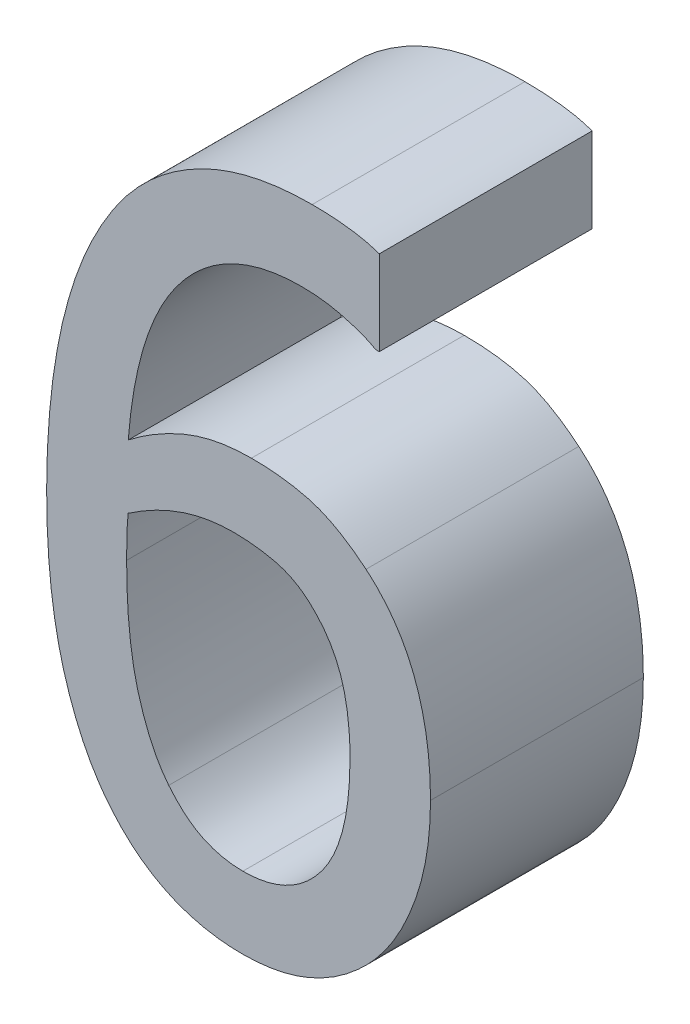
ISO-10303-21;
HEADER;
FILE_DESCRIPTION(('STEP AP214'),'2;1');
FILE_NAME('part.step','',(''),(''),'','','');
FILE_SCHEMA(('AUTOMOTIVE_DESIGN { 1 0 10303 214 1 1 1 1 }'));
ENDSEC;
DATA;
#1=APPLICATION_CONTEXT('core data for automotive mechanical design processes');
#2=APPLICATION_PROTOCOL_DEFINITION('international standard','automotive_design',2000,#1);
#3=PRODUCT_CONTEXT('',#1,'mechanical');
#4=PRODUCT('Part','Part','',(#3));
#5=PRODUCT_RELATED_PRODUCT_CATEGORY('part','',(#4));
#6=PRODUCT_DEFINITION_FORMATION('','',#4);
#7=PRODUCT_DEFINITION_CONTEXT('part definition',#1,'design');
#8=PRODUCT_DEFINITION('design','',#6,#7);
#9=PRODUCT_DEFINITION_SHAPE('','',#8);
#10=(LENGTH_UNIT() NAMED_UNIT(*) SI_UNIT(.MILLI.,.METRE.));
#11=(NAMED_UNIT(*) PLANE_ANGLE_UNIT() SI_UNIT($,.RADIAN.));
#12=(NAMED_UNIT(*) SI_UNIT($,.STERADIAN.) SOLID_ANGLE_UNIT());
#13=UNCERTAINTY_MEASURE_WITH_UNIT(LENGTH_MEASURE(1.E-05),#10,'distance_accuracy_value','');
#14=(GEOMETRIC_REPRESENTATION_CONTEXT(3) GLOBAL_UNCERTAINTY_ASSIGNED_CONTEXT((#13)) GLOBAL_UNIT_ASSIGNED_CONTEXT((#10,
#11,#12)) REPRESENTATION_CONTEXT('',''));
#15=CARTESIAN_POINT('',(0.,0.,0.));
#16=DIRECTION('',(0.,0.,1.));
#17=DIRECTION('',(1.,0.,0.));
#18=AXIS2_PLACEMENT_3D('',#15,#16,#17);
#19=CARTESIAN_POINT('',(-3.363706636507,0.216730596900024,0.));
#20=CARTESIAN_POINT('',(-3.363706636507,0.216730596900024,0.1));
#21=CARTESIAN_POINT('',(-3.34116263985,0.216730596900024,0.));
#22=CARTESIAN_POINT('',(-3.34116263985,0.216730596900024,0.1));
#23=CARTESIAN_POINT('',(-3.313358377307,0.252300013847772,0.));
#24=CARTESIAN_POINT('',(-3.313358377307,0.252300013847772,0.1));
#25=CARTESIAN_POINT('',(-3.313358377307,0.287869430795519,0.));
#26=CARTESIAN_POINT('',(-3.313358377307,0.287869430795519,0.1));
#27=B_SPLINE_SURFACE_WITH_KNOTS('',2,1,((#19,#20),(#21,#22),(#23,#24),(#25,#26)),.UNSPECIFIED.,
.F.,.F.,.F.,(3,1,3),(2,2),(0.,1.,2.),(0.,0.01),.UNSPECIFIED.);
#28=CARTESIAN_POINT('',(-3.363706636507,0.216730596900024,0.));
#29=CARTESIAN_POINT('',(-3.34116263985,0.216730596900024,0.));
#30=CARTESIAN_POINT('',(-3.313358377307,0.252300013847772,0.));
#31=CARTESIAN_POINT('',(-3.313358377307,0.287869430795519,0.));
#32=B_SPLINE_CURVE_WITH_KNOTS('',2,(#28,#29,#30,#31),.UNSPECIFIED.,.F.,.F.,(3,1,3),(0.,1.,2.),.UNSPECIFIED.);
#33=CARTESIAN_POINT('',(-3.363706636507,0.216730596900024,0.));
#34=VERTEX_POINT('',#33);
#35=CARTESIAN_POINT('',(-3.313358377307,0.287869430795519,0.));
#36=VERTEX_POINT('',#35);
#37=EDGE_CURVE('E11',#34,#36,#32,.T.);
#38=DIRECTION('',(0.,0.,1.));
#39=VECTOR('',#38,1.);
#40=CARTESIAN_POINT('',(-3.363706636507,0.216730596900024,0.));
#41=LINE('',#40,#39);
#42=CARTESIAN_POINT('',(-3.363706636507,0.216730596900024,0.1));
#43=VERTEX_POINT('',#42);
#44=EDGE_CURVE('E28',#34,#43,#41,.T.);
#45=CARTESIAN_POINT('',(-3.313358377307,0.287869430795519,0.1));
#46=CARTESIAN_POINT('',(-3.313358377307,0.252300013847772,0.1));
#47=CARTESIAN_POINT('',(-3.34116263985,0.216730596900024,0.1));
#48=CARTESIAN_POINT('',(-3.363706636507,0.216730596900024,0.1));
#49=B_SPLINE_CURVE_WITH_KNOTS('',2,(#45,#46,#47,#48),.UNSPECIFIED.,.F.,.F.,(3,1,3),(-2.,-1.,0.),.UNSPECIFIED.);
#50=CARTESIAN_POINT('',(-3.313358377307,0.287869430795519,0.1));
#51=VERTEX_POINT('',#50);
#52=EDGE_CURVE('E513',#51,#43,#49,.T.);
#53=DIRECTION('',(0.,0.,1.));
#54=VECTOR('',#53,1.);
#55=CARTESIAN_POINT('',(-3.313358377307,0.287869430795519,0.));
#56=LINE('',#55,#54);
#57=EDGE_CURVE('E41',#36,#51,#56,.T.);
#58=ORIENTED_EDGE('',*,*,#37,.F.);
#59=ORIENTED_EDGE('',*,*,#44,.T.);
#60=ORIENTED_EDGE('',*,*,#52,.F.);
#61=ORIENTED_EDGE('',*,*,#57,.F.);
#62=EDGE_LOOP('',(#58,#59,#60,#61));
#63=FACE_BOUND('',#62,.T.);
#64=ADVANCED_FACE('F17',(#63),#27,.F.);
#65=CARTESIAN_POINT('',(-3.3985245869,0.234264816522153,0.));
#66=CARTESIAN_POINT('',(-3.3985245869,0.234264816522153,0.1));
#67=CARTESIAN_POINT('',(-3.390508943644,0.22449575130411,0.));
#68=CARTESIAN_POINT('',(-3.390508943644,0.22449575130411,0.1));
#69=CARTESIAN_POINT('',(-3.373475701725,0.216730596900024,0.));
#70=CARTESIAN_POINT('',(-3.373475701725,0.216730596900024,0.1));
#71=CARTESIAN_POINT('',(-3.363706636507,0.216730596900024,0.));
#72=CARTESIAN_POINT('',(-3.363706636507,0.216730596900024,0.1));
#73=B_SPLINE_SURFACE_WITH_KNOTS('',2,1,((#65,#66),(#67,#68),(#69,#70),(#71,#72)),.UNSPECIFIED.,
.F.,.F.,.F.,(3,1,3),(2,2),(0.,1.,2.),(0.,0.01),.UNSPECIFIED.);
#74=CARTESIAN_POINT('',(-3.3985245869,0.234264816522153,0.));
#75=CARTESIAN_POINT('',(-3.390508943644,0.22449575130411,0.));
#76=CARTESIAN_POINT('',(-3.373475701725,0.216730596900024,0.));
#77=CARTESIAN_POINT('',(-3.363706636507,0.216730596900024,0.));
#78=B_SPLINE_CURVE_WITH_KNOTS('',2,(#74,#75,#76,#77),.UNSPECIFIED.,.F.,.F.,(3,1,3),(0.,1.,2.),.UNSPECIFIED.);
#79=CARTESIAN_POINT('',(-3.3985245869,0.234264816522153,0.));
#80=VERTEX_POINT('',#79);
#81=EDGE_CURVE('E504',#80,#34,#78,.T.);
#82=DIRECTION('',(0.,0.,1.));
#83=VECTOR('',#82,1.);
#84=CARTESIAN_POINT('',(-3.3985245869,0.234264816522153,0.));
#85=LINE('',#84,#83);
#86=CARTESIAN_POINT('',(-3.3985245869,0.234264816522153,0.1));
#87=VERTEX_POINT('',#86);
#88=EDGE_CURVE('E498',#80,#87,#85,.T.);
#89=CARTESIAN_POINT('',(-3.363706636507,0.216730596900024,0.1));
#90=CARTESIAN_POINT('',(-3.373475701725,0.216730596900024,0.1));
#91=CARTESIAN_POINT('',(-3.390508943644,0.22449575130411,0.1));
#92=CARTESIAN_POINT('',(-3.3985245869,0.234264816522153,0.1));
#93=B_SPLINE_CURVE_WITH_KNOTS('',2,(#89,#90,#91,#92),.UNSPECIFIED.,.F.,.F.,(3,1,3),(-2.,-1.,0.),.UNSPECIFIED.);
#94=EDGE_CURVE('E491',#43,#87,#93,.T.);
#95=ORIENTED_EDGE('',*,*,#81,.F.);
#96=ORIENTED_EDGE('',*,*,#88,.T.);
#97=ORIENTED_EDGE('',*,*,#94,.F.);
#98=ORIENTED_EDGE('',*,*,#44,.F.);
#99=EDGE_LOOP('',(#95,#96,#97,#98));
#100=FACE_BOUND('',#99,.T.);
#101=ADVANCED_FACE('F519',(#100),#73,.F.);
#102=CARTESIAN_POINT('',(-3.418313206188,0.315924182190926,0.));
#103=CARTESIAN_POINT('',(-3.418313206188,0.315924182190926,0.1));
#104=CARTESIAN_POINT('',(-3.418313206188,0.283861609167604,0.));
#105=CARTESIAN_POINT('',(-3.418313206188,0.283861609167604,0.1));
#106=CARTESIAN_POINT('',(-3.407041207859,0.244534859443686,0.));
#107=CARTESIAN_POINT('',(-3.407041207859,0.244534859443686,0.1));
#108=CARTESIAN_POINT('',(-3.3985245869,0.234264816522153,0.));
#109=CARTESIAN_POINT('',(-3.3985245869,0.234264816522153,0.1));
#110=B_SPLINE_SURFACE_WITH_KNOTS('',2,1,((#102,#103),(#104,#105),(#106,#107),(#108,#109)),
.UNSPECIFIED.,.F.,.F.,.F.,(3,1,3),(2,2),(0.,1.,2.),(0.,0.01),.UNSPECIFIED.);
#111=CARTESIAN_POINT('',(-3.418313206188,0.315924182190926,0.));
#112=CARTESIAN_POINT('',(-3.418313206188,0.283861609167604,0.));
#113=CARTESIAN_POINT('',(-3.407041207859,0.244534859443686,0.));
#114=CARTESIAN_POINT('',(-3.3985245869,0.234264816522153,0.));
#115=B_SPLINE_CURVE_WITH_KNOTS('',2,(#111,#112,#113,#114),.UNSPECIFIED.,.F.,.F.,(3,1,3),(0.,1.,
2.),.UNSPECIFIED.);
#116=CARTESIAN_POINT('',(-3.418313206188,0.315924182190926,0.));
#117=VERTEX_POINT('',#116);
#118=EDGE_CURVE('E486',#117,#80,#115,.T.);
#119=DIRECTION('',(0.,0.,1.));
#120=VECTOR('',#119,1.);
#121=CARTESIAN_POINT('',(-3.418313206188,0.315924182190926,0.));
#122=LINE('',#121,#120);
#123=CARTESIAN_POINT('',(-3.418313206188,0.315924182190926,0.1));
#124=VERTEX_POINT('',#123);
#125=EDGE_CURVE('E480',#117,#124,#122,.T.);
#126=CARTESIAN_POINT('',(-3.3985245869,0.234264816522153,0.1));
#127=CARTESIAN_POINT('',(-3.407041207859,0.244534859443686,0.1));
#128=CARTESIAN_POINT('',(-3.418313206188,0.283861609167604,0.1));
#129=CARTESIAN_POINT('',(-3.418313206188,0.315924182190926,0.1));
#130=B_SPLINE_CURVE_WITH_KNOTS('',2,(#126,#127,#128,#129),.UNSPECIFIED.,.F.,.F.,(3,1,3),(-2.,
-1.,0.),.UNSPECIFIED.);
#131=EDGE_CURVE('E473',#87,#124,#130,.T.);
#132=ORIENTED_EDGE('',*,*,#118,.F.);
#133=ORIENTED_EDGE('',*,*,#125,.T.);
#134=ORIENTED_EDGE('',*,*,#131,.F.);
#135=ORIENTED_EDGE('',*,*,#88,.F.);
#136=EDGE_LOOP('',(#132,#133,#134,#135));
#137=FACE_BOUND('',#136,.T.);
#138=ADVANCED_FACE('F532',(#137),#110,.F.);
#139=CARTESIAN_POINT('',(-3.417561739632,0.335462312627012,0.));
#140=CARTESIAN_POINT('',(-3.417561739632,0.335462312627012,0.1));
#141=CARTESIAN_POINT('',(-3.418062717336,0.330953513295608,0.));
#142=CARTESIAN_POINT('',(-3.418062717336,0.330953513295608,0.1));
#143=CARTESIAN_POINT('',(-3.418313206188,0.322436892336288,0.));
#144=CARTESIAN_POINT('',(-3.418313206188,0.322436892336288,0.1));
#145=CARTESIAN_POINT('',(-3.418313206188,0.315924182190926,0.));
#146=CARTESIAN_POINT('',(-3.418313206188,0.315924182190926,0.1));
#147=B_SPLINE_SURFACE_WITH_KNOTS('',2,1,((#139,#140),(#141,#142),(#143,#144),(#145,#146)),
.UNSPECIFIED.,.F.,.F.,.F.,(3,1,3),(2,2),(0.,1.,2.),(0.,0.01),.UNSPECIFIED.);
#148=CARTESIAN_POINT('',(-3.417561739632,0.335462312627012,0.));
#149=CARTESIAN_POINT('',(-3.418062717336,0.330953513295608,0.));
#150=CARTESIAN_POINT('',(-3.418313206188,0.322436892336288,0.));
#151=CARTESIAN_POINT('',(-3.418313206188,0.315924182190926,0.));
#152=B_SPLINE_CURVE_WITH_KNOTS('',2,(#148,#149,#150,#151),.UNSPECIFIED.,.F.,.F.,(3,1,3),(0.,1.,
2.),.UNSPECIFIED.);
#153=CARTESIAN_POINT('',(-3.417561739632,0.335462312627012,0.));
#154=VERTEX_POINT('',#153);
#155=EDGE_CURVE('E468',#154,#117,#152,.T.);
#156=DIRECTION('',(0.,0.,1.));
#157=VECTOR('',#156,1.);
#158=CARTESIAN_POINT('',(-3.417561739632,0.335462312627012,0.));
#159=LINE('',#158,#157);
#160=CARTESIAN_POINT('',(-3.417561739632,0.335462312627012,0.1));
#161=VERTEX_POINT('',#160);
#162=EDGE_CURVE('E462',#154,#161,#159,.T.);
#163=CARTESIAN_POINT('',(-3.418313206188,0.315924182190926,0.1));
#164=CARTESIAN_POINT('',(-3.418313206188,0.322436892336288,0.1));
#165=CARTESIAN_POINT('',(-3.418062717336,0.330953513295608,0.1));
#166=CARTESIAN_POINT('',(-3.417561739632,0.335462312627012,0.1));
#167=B_SPLINE_CURVE_WITH_KNOTS('',2,(#163,#164,#165,#166),.UNSPECIFIED.,.F.,.F.,(3,1,3),(-2.,
-1.,0.),.UNSPECIFIED.);
#168=EDGE_CURVE('E455',#124,#161,#167,.T.);
#169=ORIENTED_EDGE('',*,*,#155,.F.);
#170=ORIENTED_EDGE('',*,*,#162,.T.);
#171=ORIENTED_EDGE('',*,*,#168,.F.);
#172=ORIENTED_EDGE('',*,*,#125,.F.);
#173=EDGE_LOOP('',(#169,#170,#171,#172));
#174=FACE_BOUND('',#173,.T.);
#175=ADVANCED_FACE('F535',(#174),#147,.F.);
#176=CARTESIAN_POINT('',(-3.367964946987,0.352495554545652,0.));
#177=CARTESIAN_POINT('',(-3.367964946987,0.352495554545652,0.1));
#178=CARTESIAN_POINT('',(-3.380990367278,0.352495554545652,0.));
#179=CARTESIAN_POINT('',(-3.380990367278,0.352495554545652,0.1));
#180=CARTESIAN_POINT('',(-3.405538274749,0.343728444734587,0.));
#181=CARTESIAN_POINT('',(-3.405538274749,0.343728444734587,0.1));
#182=CARTESIAN_POINT('',(-3.417561739632,0.335462312627012,0.));
#183=CARTESIAN_POINT('',(-3.417561739632,0.335462312627012,0.1));
#184=B_SPLINE_SURFACE_WITH_KNOTS('',2,1,((#176,#177),(#178,#179),(#180,#181),(#182,#183)),
.UNSPECIFIED.,.F.,.F.,.F.,(3,1,3),(2,2),(0.,1.,2.),(0.,0.01),.UNSPECIFIED.);
#185=CARTESIAN_POINT('',(-3.367964946987,0.352495554545652,0.));
#186=CARTESIAN_POINT('',(-3.380990367278,0.352495554545652,0.));
#187=CARTESIAN_POINT('',(-3.405538274749,0.343728444734587,0.));
#188=CARTESIAN_POINT('',(-3.417561739632,0.335462312627012,0.));
#189=B_SPLINE_CURVE_WITH_KNOTS('',2,(#185,#186,#187,#188),.UNSPECIFIED.,.F.,.F.,(3,1,3),(0.,1.,
2.),.UNSPECIFIED.);
#190=CARTESIAN_POINT('',(-3.367964946987,0.352495554545652,0.));
#191=VERTEX_POINT('',#190);
#192=EDGE_CURVE('E450',#191,#154,#189,.T.);
#193=DIRECTION('',(0.,0.,1.));
#194=VECTOR('',#193,1.);
#195=CARTESIAN_POINT('',(-3.367964946987,0.352495554545652,0.));
#196=LINE('',#195,#194);
#197=CARTESIAN_POINT('',(-3.367964946987,0.352495554545652,0.1));
#198=VERTEX_POINT('',#197);
#199=EDGE_CURVE('E444',#191,#198,#196,.T.);
#200=CARTESIAN_POINT('',(-3.417561739632,0.335462312627012,0.1));
#201=CARTESIAN_POINT('',(-3.405538274749,0.343728444734587,0.1));
#202=CARTESIAN_POINT('',(-3.380990367278,0.352495554545652,0.1));
#203=CARTESIAN_POINT('',(-3.367964946987,0.352495554545652,0.1));
#204=B_SPLINE_CURVE_WITH_KNOTS('',2,(#200,#201,#202,#203),.UNSPECIFIED.,.F.,.F.,(3,1,3),(-2.,
-1.,0.),.UNSPECIFIED.);
#205=EDGE_CURVE('E437',#161,#198,#204,.T.);
#206=ORIENTED_EDGE('',*,*,#192,.F.);
#207=ORIENTED_EDGE('',*,*,#199,.T.);
#208=ORIENTED_EDGE('',*,*,#205,.F.);
#209=ORIENTED_EDGE('',*,*,#162,.F.);
#210=EDGE_LOOP('',(#206,#207,#208,#209));
#211=FACE_BOUND('',#210,.T.);
#212=ADVANCED_FACE('F539',(#211),#184,.F.);
#213=CARTESIAN_POINT('',(-3.332395530039,0.34172453392063,0.));
#214=CARTESIAN_POINT('',(-3.332395530039,0.34172453392063,0.1));
#215=CARTESIAN_POINT('',(-3.33965970674,0.348237244065992,0.));
#216=CARTESIAN_POINT('',(-3.33965970674,0.348237244065992,0.1));
#217=CARTESIAN_POINT('',(-3.358195881769,0.352495554545652,0.));
#218=CARTESIAN_POINT('',(-3.358195881769,0.352495554545652,0.1));
#219=CARTESIAN_POINT('',(-3.367964946987,0.352495554545652,0.));
#220=CARTESIAN_POINT('',(-3.367964946987,0.352495554545652,0.1));
#221=B_SPLINE_SURFACE_WITH_KNOTS('',2,1,((#213,#214),(#215,#216),(#217,#218),(#219,#220)),
.UNSPECIFIED.,.F.,.F.,.F.,(3,1,3),(2,2),(0.,1.,2.),(0.,0.01),.UNSPECIFIED.);
#222=CARTESIAN_POINT('',(-3.332395530039,0.34172453392063,0.));
#223=CARTESIAN_POINT('',(-3.33965970674,0.348237244065992,0.));
#224=CARTESIAN_POINT('',(-3.358195881769,0.352495554545652,0.));
#225=CARTESIAN_POINT('',(-3.367964946987,0.352495554545652,0.));
#226=B_SPLINE_CURVE_WITH_KNOTS('',2,(#222,#223,#224,#225),.UNSPECIFIED.,.F.,.F.,(3,1,3),(0.,1.,
2.),.UNSPECIFIED.);
#227=CARTESIAN_POINT('',(-3.332395530039,0.34172453392063,0.));
#228=VERTEX_POINT('',#227);
#229=EDGE_CURVE('E432',#228,#191,#226,.T.);
#230=DIRECTION('',(0.,0.,1.));
#231=VECTOR('',#230,1.);
#232=CARTESIAN_POINT('',(-3.332395530039,0.34172453392063,0.));
#233=LINE('',#232,#231);
#234=CARTESIAN_POINT('',(-3.332395530039,0.34172453392063,0.1));
#235=VERTEX_POINT('',#234);
#236=EDGE_CURVE('E426',#228,#235,#233,.T.);
#237=CARTESIAN_POINT('',(-3.367964946987,0.352495554545652,0.1));
#238=CARTESIAN_POINT('',(-3.358195881769,0.352495554545652,0.1));
#239=CARTESIAN_POINT('',(-3.33965970674,0.348237244065992,0.1));
#240=CARTESIAN_POINT('',(-3.332395530039,0.34172453392063,0.1));
#241=B_SPLINE_CURVE_WITH_KNOTS('',2,(#237,#238,#239,#240),.UNSPECIFIED.,.F.,.F.,(3,1,3),(-2.,
-1.,0.),.UNSPECIFIED.);
#242=EDGE_CURVE('E419',#198,#235,#241,.T.);
#243=ORIENTED_EDGE('',*,*,#229,.F.);
#244=ORIENTED_EDGE('',*,*,#236,.T.);
#245=ORIENTED_EDGE('',*,*,#242,.F.);
#246=ORIENTED_EDGE('',*,*,#199,.F.);
#247=EDGE_LOOP('',(#243,#244,#245,#246));
#248=FACE_BOUND('',#247,.T.);
#249=ADVANCED_FACE('F541',(#248),#221,.F.);
#250=CARTESIAN_POINT('',(-3.313358377307,0.287869430795519,0.));
#251=CARTESIAN_POINT('',(-3.313358377307,0.287869430795519,0.1));
#252=CARTESIAN_POINT('',(-3.313358377307,0.306906583528116,0.));
#253=CARTESIAN_POINT('',(-3.313358377307,0.306906583528116,0.1));
#254=CARTESIAN_POINT('',(-3.322375975969,0.33270693525782,0.));
#255=CARTESIAN_POINT('',(-3.322375975969,0.33270693525782,0.1));
#256=CARTESIAN_POINT('',(-3.332395530039,0.34172453392063,0.));
#257=CARTESIAN_POINT('',(-3.332395530039,0.34172453392063,0.1));
#258=B_SPLINE_SURFACE_WITH_KNOTS('',2,1,((#250,#251),(#252,#253),(#254,#255),(#256,#257)),
.UNSPECIFIED.,.F.,.F.,.F.,(3,1,3),(2,2),(0.,1.,2.),(0.,0.01),.UNSPECIFIED.);
#259=CARTESIAN_POINT('',(-3.313358377307,0.287869430795519,0.));
#260=CARTESIAN_POINT('',(-3.313358377307,0.306906583528116,0.));
#261=CARTESIAN_POINT('',(-3.322375975969,0.33270693525782,0.));
#262=CARTESIAN_POINT('',(-3.332395530039,0.34172453392063,0.));
#263=B_SPLINE_CURVE_WITH_KNOTS('',2,(#259,#260,#261,#262),.UNSPECIFIED.,.F.,.F.,(3,1,3),(0.,1.,
2.),.UNSPECIFIED.);
#264=EDGE_CURVE('E411',#36,#228,#263,.T.);
#265=CARTESIAN_POINT('',(-3.332395530039,0.34172453392063,0.1));
#266=CARTESIAN_POINT('',(-3.322375975969,0.33270693525782,0.1));
#267=CARTESIAN_POINT('',(-3.313358377307,0.306906583528116,0.1));
#268=CARTESIAN_POINT('',(-3.313358377307,0.287869430795519,0.1));
#269=B_SPLINE_CURVE_WITH_KNOTS('',2,(#265,#266,#267,#268),.UNSPECIFIED.,.F.,.F.,(3,1,3),(-2.,
-1.,0.),.UNSPECIFIED.);
#270=EDGE_CURVE('E403',#235,#51,#269,.T.);
#271=ORIENTED_EDGE('',*,*,#264,.F.);
#272=ORIENTED_EDGE('',*,*,#57,.T.);
#273=ORIENTED_EDGE('',*,*,#270,.F.);
#274=ORIENTED_EDGE('',*,*,#236,.F.);
#275=EDGE_LOOP('',(#271,#272,#273,#274));
#276=FACE_BOUND('',#275,.T.);
#277=ADVANCED_FACE('F525',(#276),#258,.F.);
#278=CARTESIAN_POINT('',(-3.363957125359,0.18291460191449,0.));
#279=CARTESIAN_POINT('',(-3.363957125359,0.18291460191449,0.1));
#280=CARTESIAN_POINT('',(-3.345170461478,0.18291460191449,0.));
#281=CARTESIAN_POINT('',(-3.345170461478,0.18291460191449,0.1));
#282=CARTESIAN_POINT('',(-3.314109843862,0.197693444167427,0.));
#283=CARTESIAN_POINT('',(-3.314109843862,0.197693444167427,0.1));
#284=CARTESIAN_POINT('',(-3.301585401275,0.211971308716875,0.));
#285=CARTESIAN_POINT('',(-3.301585401275,0.211971308716875,0.1));
#286=B_SPLINE_SURFACE_WITH_KNOTS('',2,1,((#278,#279),(#280,#281),(#282,#283),(#284,#285)),
.UNSPECIFIED.,.F.,.F.,.F.,(3,1,3),(2,2),(-2.,-1.,0.),(0.,0.01),.UNSPECIFIED.);
#287=CARTESIAN_POINT('',(-3.301585401275,0.211971308716875,0.));
#288=CARTESIAN_POINT('',(-3.314109843862,0.197693444167427,0.));
#289=CARTESIAN_POINT('',(-3.345170461478,0.18291460191449,0.));
#290=CARTESIAN_POINT('',(-3.363957125359,0.18291460191449,0.));
#291=B_SPLINE_CURVE_WITH_KNOTS('',2,(#287,#288,#289,#290),.UNSPECIFIED.,.F.,.F.,(3,1,3),(0.,1.,
2.),.UNSPECIFIED.);
#292=CARTESIAN_POINT('',(-3.301585401275,0.211971308716875,0.));
#293=VERTEX_POINT('',#292);
#294=CARTESIAN_POINT('',(-3.363957125359,0.18291460191449,0.));
#295=VERTEX_POINT('',#294);
#296=EDGE_CURVE('E399',#293,#295,#291,.T.);
#297=DIRECTION('',(0.,0.,1.));
#298=VECTOR('',#297,1.);
#299=CARTESIAN_POINT('',(-3.301585401275,0.211971308716875,0.));
#300=LINE('',#299,#298);
#301=CARTESIAN_POINT('',(-3.301585401275,0.211971308716875,0.1));
#302=VERTEX_POINT('',#301);
#303=EDGE_CURVE('E394',#293,#302,#300,.T.);
#304=CARTESIAN_POINT('',(-3.363957125359,0.18291460191449,0.1));
#305=CARTESIAN_POINT('',(-3.345170461478,0.18291460191449,0.1));
#306=CARTESIAN_POINT('',(-3.314109843862,0.197693444167427,0.1));
#307=CARTESIAN_POINT('',(-3.301585401275,0.211971308716875,0.1));
#308=B_SPLINE_CURVE_WITH_KNOTS('',2,(#304,#305,#306,#307),.UNSPECIFIED.,.F.,.F.,(3,1,3),(-2.,
-1.,0.),.UNSPECIFIED.);
#309=CARTESIAN_POINT('',(-3.363957125359,0.18291460191449,0.1));
#310=VERTEX_POINT('',#309);
#311=EDGE_CURVE('E189',#310,#302,#308,.T.);
#312=DIRECTION('',(0.,0.,1.));
#313=VECTOR('',#312,1.);
#314=CARTESIAN_POINT('',(-3.363957125359,0.18291460191449,0.));
#315=LINE('',#314,#313);
#316=EDGE_CURVE('E385',#295,#310,#315,.T.);
#317=ORIENTED_EDGE('',*,*,#296,.F.);
#318=ORIENTED_EDGE('',*,*,#303,.T.);
#319=ORIENTED_EDGE('',*,*,#311,.F.);
#320=ORIENTED_EDGE('',*,*,#316,.F.);
#321=EDGE_LOOP('',(#317,#318,#319,#320));
#322=FACE_BOUND('',#321,.T.);
#323=ADVANCED_FACE('F549',(#322),#286,.T.);
#324=CARTESIAN_POINT('',(-3.425326894036,0.210969353309896,0.));
#325=CARTESIAN_POINT('',(-3.425326894036,0.210969353309896,0.1));
#326=CARTESIAN_POINT('',(-3.413553918004,0.196941977612193,0.));
#327=CARTESIAN_POINT('',(-3.413553918004,0.196941977612193,0.1));
#328=CARTESIAN_POINT('',(-3.38274378924,0.18291460191449,0.));
#329=CARTESIAN_POINT('',(-3.38274378924,0.18291460191449,0.1));
#330=CARTESIAN_POINT('',(-3.363957125359,0.18291460191449,0.));
#331=CARTESIAN_POINT('',(-3.363957125359,0.18291460191449,0.1));
#332=B_SPLINE_SURFACE_WITH_KNOTS('',2,1,((#324,#325),(#326,#327),(#328,#329),(#330,#331)),
.UNSPECIFIED.,.F.,.F.,.F.,(3,1,3),(2,2),(-2.,-1.,0.),(0.,0.01),.UNSPECIFIED.);
#333=CARTESIAN_POINT('',(-3.363957125359,0.18291460191449,0.));
#334=CARTESIAN_POINT('',(-3.38274378924,0.18291460191449,0.));
#335=CARTESIAN_POINT('',(-3.413553918004,0.196941977612193,0.));
#336=CARTESIAN_POINT('',(-3.425326894036,0.210969353309896,0.));
#337=B_SPLINE_CURVE_WITH_KNOTS('',2,(#333,#334,#335,#336),.UNSPECIFIED.,.F.,.F.,(3,1,3),(0.,1.,
2.),.UNSPECIFIED.);
#338=CARTESIAN_POINT('',(-3.425326894036,0.210969353309896,0.));
#339=VERTEX_POINT('',#338);
#340=EDGE_CURVE('E378',#295,#339,#337,.T.);
#341=CARTESIAN_POINT('',(-3.425326894036,0.210969353309896,0.1));
#342=CARTESIAN_POINT('',(-3.413553918004,0.196941977612193,0.1));
#343=CARTESIAN_POINT('',(-3.38274378924,0.18291460191449,0.1));
#344=CARTESIAN_POINT('',(-3.363957125359,0.18291460191449,0.1));
#345=B_SPLINE_CURVE_WITH_KNOTS('',2,(#341,#342,#343,#344),.UNSPECIFIED.,.F.,.F.,(3,1,3),(-2.,
-1.,0.),.UNSPECIFIED.);
#346=CARTESIAN_POINT('',(-3.425326894036,0.210969353309896,0.1));
#347=VERTEX_POINT('',#346);
#348=EDGE_CURVE('E374',#347,#310,#345,.T.);
#349=DIRECTION('',(0.,0.,1.));
#350=VECTOR('',#349,1.);
#351=CARTESIAN_POINT('',(-3.425326894036,0.210969353309896,0.));
#352=LINE('',#351,#350);
#353=EDGE_CURVE('E368',#339,#347,#352,.T.);
#354=ORIENTED_EDGE('',*,*,#340,.F.);
#355=ORIENTED_EDGE('',*,*,#316,.T.);
#356=ORIENTED_EDGE('',*,*,#348,.F.);
#357=ORIENTED_EDGE('',*,*,#353,.F.);
#358=EDGE_LOOP('',(#354,#355,#356,#357));
#359=FACE_BOUND('',#358,.T.);
#360=ADVANCED_FACE('F627',(#359),#332,.T.);
#361=CARTESIAN_POINT('',(-3.455886533949,0.325192269705479,0.));
#362=CARTESIAN_POINT('',(-3.455886533949,0.325192269705479,0.1));
#363=CARTESIAN_POINT('',(-3.455886533949,0.284112098019349,0.));
#364=CARTESIAN_POINT('',(-3.455886533949,0.284112098019349,0.1));
#365=CARTESIAN_POINT('',(-3.439604758586,0.227752106376791,0.));
#366=CARTESIAN_POINT('',(-3.439604758586,0.227752106376791,0.1));
#367=CARTESIAN_POINT('',(-3.425326894036,0.210969353309896,0.));
#368=CARTESIAN_POINT('',(-3.425326894036,0.210969353309896,0.1));
#369=B_SPLINE_SURFACE_WITH_KNOTS('',2,1,((#361,#362),(#363,#364),(#365,#366),(#367,#368)),
.UNSPECIFIED.,.F.,.F.,.F.,(3,1,3),(2,2),(-2.,-1.,0.),(0.,0.01),.UNSPECIFIED.);
#370=CARTESIAN_POINT('',(-3.425326894036,0.210969353309896,0.));
#371=CARTESIAN_POINT('',(-3.439604758586,0.227752106376791,0.));
#372=CARTESIAN_POINT('',(-3.455886533949,0.284112098019349,0.));
#373=CARTESIAN_POINT('',(-3.455886533949,0.325192269705479,0.));
#374=B_SPLINE_CURVE_WITH_KNOTS('',2,(#370,#371,#372,#373),.UNSPECIFIED.,.F.,.F.,(3,1,3),(0.,1.,
2.),.UNSPECIFIED.);
#375=CARTESIAN_POINT('',(-3.455886533949,0.325192269705479,0.));
#376=VERTEX_POINT('',#375);
#377=EDGE_CURVE('E361',#339,#376,#374,.T.);
#378=CARTESIAN_POINT('',(-3.455886533949,0.325192269705479,0.1));
#379=CARTESIAN_POINT('',(-3.455886533949,0.284112098019349,0.1));
#380=CARTESIAN_POINT('',(-3.439604758586,0.227752106376791,0.1));
#381=CARTESIAN_POINT('',(-3.425326894036,0.210969353309896,0.1));
#382=B_SPLINE_CURVE_WITH_KNOTS('',2,(#378,#379,#380,#381),.UNSPECIFIED.,.F.,.F.,(3,1,3),(-2.,
-1.,0.),.UNSPECIFIED.);
#383=CARTESIAN_POINT('',(-3.455886533949,0.325192269705479,0.1));
#384=VERTEX_POINT('',#383);
#385=EDGE_CURVE('E356',#384,#347,#382,.T.);
#386=DIRECTION('',(0.,0.,1.));
#387=VECTOR('',#386,1.);
#388=CARTESIAN_POINT('',(-3.455886533949,0.325192269705479,0.));
#389=LINE('',#388,#387);
#390=EDGE_CURVE('E350',#376,#384,#389,.T.);
#391=ORIENTED_EDGE('',*,*,#377,.F.);
#392=ORIENTED_EDGE('',*,*,#353,.T.);
#393=ORIENTED_EDGE('',*,*,#385,.F.);
#394=ORIENTED_EDGE('',*,*,#390,.F.);
#395=EDGE_LOOP('',(#391,#392,#393,#394));
#396=FACE_BOUND('',#395,.T.);
#397=ADVANCED_FACE('F637',(#396),#369,.T.);
#398=CARTESIAN_POINT('',(-3.425326894036,0.454444517205745,0.));
#399=CARTESIAN_POINT('',(-3.425326894036,0.454444517205745,0.1));
#400=CARTESIAN_POINT('',(-3.440857202845,0.430397587438253,0.));
#401=CARTESIAN_POINT('',(-3.440857202845,0.430397587438253,0.1));
#402=CARTESIAN_POINT('',(-3.455886533949,0.365520974836376,0.));
#403=CARTESIAN_POINT('',(-3.455886533949,0.365520974836376,0.1));
#404=CARTESIAN_POINT('',(-3.455886533949,0.325192269705479,0.));
#405=CARTESIAN_POINT('',(-3.455886533949,0.325192269705479,0.1));
#406=B_SPLINE_SURFACE_WITH_KNOTS('',2,1,((#398,#399),(#400,#401),(#402,#403),(#404,#405)),
.UNSPECIFIED.,.F.,.F.,.F.,(3,1,3),(2,2),(-2.,-1.,0.),(0.,0.01),.UNSPECIFIED.);
#407=CARTESIAN_POINT('',(-3.455886533949,0.325192269705479,0.));
#408=CARTESIAN_POINT('',(-3.455886533949,0.365520974836376,0.));
#409=CARTESIAN_POINT('',(-3.440857202845,0.430397587438253,0.));
#410=CARTESIAN_POINT('',(-3.425326894036,0.454444517205745,0.));
#411=B_SPLINE_CURVE_WITH_KNOTS('',2,(#407,#408,#409,#410),.UNSPECIFIED.,.F.,.F.,(3,1,3),(0.,1.,
2.),.UNSPECIFIED.);
#412=CARTESIAN_POINT('',(-3.425326894036,0.454444517205745,0.));
#413=VERTEX_POINT('',#412);
#414=EDGE_CURVE('E343',#376,#413,#411,.T.);
#415=CARTESIAN_POINT('',(-3.425326894036,0.454444517205745,0.1));
#416=CARTESIAN_POINT('',(-3.440857202845,0.430397587438253,0.1));
#417=CARTESIAN_POINT('',(-3.455886533949,0.365520974836376,0.1));
#418=CARTESIAN_POINT('',(-3.455886533949,0.325192269705479,0.1));
#419=B_SPLINE_CURVE_WITH_KNOTS('',2,(#415,#416,#417,#418),.UNSPECIFIED.,.F.,.F.,(3,1,3),(-2.,
-1.,0.),.UNSPECIFIED.);
#420=CARTESIAN_POINT('',(-3.425326894036,0.454444517205745,0.1));
#421=VERTEX_POINT('',#420);
#422=EDGE_CURVE('E338',#421,#384,#419,.T.);
#423=DIRECTION('',(0.,0.,1.));
#424=VECTOR('',#423,1.);
#425=CARTESIAN_POINT('',(-3.425326894036,0.454444517205745,0.));
#426=LINE('',#425,#424);
#427=EDGE_CURVE('E332',#413,#421,#426,.T.);
#428=ORIENTED_EDGE('',*,*,#414,.F.);
#429=ORIENTED_EDGE('',*,*,#390,.T.);
#430=ORIENTED_EDGE('',*,*,#422,.F.);
#431=ORIENTED_EDGE('',*,*,#427,.F.);
#432=EDGE_LOOP('',(#428,#429,#430,#431));
#433=FACE_BOUND('',#432,.T.);
#434=ADVANCED_FACE('F647',(#433),#406,.T.);
#435=CARTESIAN_POINT('',(-3.33114308578,0.50429179870294,0.));
#436=CARTESIAN_POINT('',(-3.33114308578,0.50429179870294,0.1));
#437=CARTESIAN_POINT('',(-3.362454192248,0.50429179870294,0.));
#438=CARTESIAN_POINT('',(-3.362454192248,0.50429179870294,0.1));
#439=CARTESIAN_POINT('',(-3.410297562932,0.477990469269746,0.));
#440=CARTESIAN_POINT('',(-3.410297562932,0.477990469269746,0.1));
#441=CARTESIAN_POINT('',(-3.425326894036,0.454444517205745,0.));
#442=CARTESIAN_POINT('',(-3.425326894036,0.454444517205745,0.1));
#443=B_SPLINE_SURFACE_WITH_KNOTS('',2,1,((#435,#436),(#437,#438),(#439,#440),(#441,#442)),
.UNSPECIFIED.,.F.,.F.,.F.,(3,1,3),(2,2),(-2.,-1.,0.),(0.,0.01),.UNSPECIFIED.);
#444=CARTESIAN_POINT('',(-3.425326894036,0.454444517205745,0.));
#445=CARTESIAN_POINT('',(-3.410297562932,0.477990469269746,0.));
#446=CARTESIAN_POINT('',(-3.362454192248,0.50429179870294,0.));
#447=CARTESIAN_POINT('',(-3.33114308578,0.50429179870294,0.));
#448=B_SPLINE_CURVE_WITH_KNOTS('',2,(#444,#445,#446,#447),.UNSPECIFIED.,.F.,.F.,(3,1,3),(0.,1.,
2.),.UNSPECIFIED.);
#449=CARTESIAN_POINT('',(-3.33114308578,0.50429179870294,0.));
#450=VERTEX_POINT('',#449);
#451=EDGE_CURVE('E325',#413,#450,#448,.T.);
#452=CARTESIAN_POINT('',(-3.33114308578,0.50429179870294,0.1));
#453=CARTESIAN_POINT('',(-3.362454192248,0.50429179870294,0.1));
#454=CARTESIAN_POINT('',(-3.410297562932,0.477990469269746,0.1));
#455=CARTESIAN_POINT('',(-3.425326894036,0.454444517205745,0.1));
#456=B_SPLINE_CURVE_WITH_KNOTS('',2,(#452,#453,#454,#455),.UNSPECIFIED.,.F.,.F.,(3,1,3),(-2.,
-1.,0.),.UNSPECIFIED.);
#457=CARTESIAN_POINT('',(-3.33114308578,0.50429179870294,0.1));
#458=VERTEX_POINT('',#457);
#459=EDGE_CURVE('E320',#458,#421,#456,.T.);
#460=DIRECTION('',(0.,0.,1.));
#461=VECTOR('',#460,1.);
#462=CARTESIAN_POINT('',(-3.33114308578,0.50429179870294,0.));
#463=LINE('',#462,#461);
#464=EDGE_CURVE('E314',#450,#458,#463,.T.);
#465=ORIENTED_EDGE('',*,*,#451,.F.);
#466=ORIENTED_EDGE('',*,*,#427,.T.);
#467=ORIENTED_EDGE('',*,*,#459,.F.);
#468=ORIENTED_EDGE('',*,*,#464,.F.);
#469=EDGE_LOOP('',(#465,#466,#467,#468));
#470=FACE_BOUND('',#469,.T.);
#471=ADVANCED_FACE('F657',(#470),#443,.T.);
#472=CARTESIAN_POINT('',(-3.299581490461,0.50003348822328,0.));
#473=CARTESIAN_POINT('',(-3.299581490461,0.50003348822328,0.1));
#474=CARTESIAN_POINT('',(-3.305843711754,0.502287887888982,0.));
#475=CARTESIAN_POINT('',(-3.305843711754,0.502287887888982,0.1));
#476=CARTESIAN_POINT('',(-3.321874998266,0.50429179870294,0.));
#477=CARTESIAN_POINT('',(-3.321874998266,0.50429179870294,0.1));
#478=CARTESIAN_POINT('',(-3.33114308578,0.50429179870294,0.));
#479=CARTESIAN_POINT('',(-3.33114308578,0.50429179870294,0.1));
#480=B_SPLINE_SURFACE_WITH_KNOTS('',2,1,((#472,#473),(#474,#475),(#476,#477),(#478,#479)),
.UNSPECIFIED.,.F.,.F.,.F.,(3,1,3),(2,2),(-2.,-1.,0.),(0.,0.01),.UNSPECIFIED.);
#481=CARTESIAN_POINT('',(-3.33114308578,0.50429179870294,0.));
#482=CARTESIAN_POINT('',(-3.321874998266,0.50429179870294,0.));
#483=CARTESIAN_POINT('',(-3.305843711754,0.502287887888982,0.));
#484=CARTESIAN_POINT('',(-3.299581490461,0.50003348822328,0.));
#485=B_SPLINE_CURVE_WITH_KNOTS('',2,(#481,#482,#483,#484),.UNSPECIFIED.,.F.,.F.,(3,1,3),(0.,1.,
2.),.UNSPECIFIED.);
#486=CARTESIAN_POINT('',(-3.299581490461,0.50003348822328,0.));
#487=VERTEX_POINT('',#486);
#488=EDGE_CURVE('E307',#450,#487,#485,.T.);
#489=CARTESIAN_POINT('',(-3.299581490461,0.50003348822328,0.1));
#490=CARTESIAN_POINT('',(-3.305843711754,0.502287887888982,0.1));
#491=CARTESIAN_POINT('',(-3.321874998266,0.50429179870294,0.1));
#492=CARTESIAN_POINT('',(-3.33114308578,0.50429179870294,0.1));
#493=B_SPLINE_CURVE_WITH_KNOTS('',2,(#489,#490,#491,#492),.UNSPECIFIED.,.F.,.F.,(3,1,3),(-2.,
-1.,0.),.UNSPECIFIED.);
#494=CARTESIAN_POINT('',(-3.299581490461,0.50003348822328,0.1));
#495=VERTEX_POINT('',#494);
#496=EDGE_CURVE('E302',#495,#458,#493,.T.);
#497=DIRECTION('',(0.,0.,1.));
#498=VECTOR('',#497,1.);
#499=CARTESIAN_POINT('',(-3.299581490461,0.50003348822328,0.));
#500=LINE('',#499,#498);
#501=EDGE_CURVE('E299',#487,#495,#500,.T.);
#502=ORIENTED_EDGE('',*,*,#488,.F.);
#503=ORIENTED_EDGE('',*,*,#464,.T.);
#504=ORIENTED_EDGE('',*,*,#496,.F.);
#505=ORIENTED_EDGE('',*,*,#501,.F.);
#506=EDGE_LOOP('',(#502,#503,#504,#505));
#507=FACE_BOUND('',#506,.T.);
#508=ADVANCED_FACE('F667',(#507),#480,.T.);
#509=CARTESIAN_POINT('',(-3.299581490461,0.460205760795873,0.));
#510=DIRECTION('',(1.,0.,0.));
#511=DIRECTION('',(0.,1.,0.));
#512=AXIS2_PLACEMENT_3D('',#509,#510,#511);
#513=PLANE('',#512);
#514=DIRECTION('',(0.,-1.,0.));
#515=VECTOR('',#514,1.);
#516=CARTESIAN_POINT('',(-3.299581490461,0.50003348822328,0.));
#517=LINE('',#516,#515);
#518=CARTESIAN_POINT('',(-3.299581490461,0.460205760795873,0.));
#519=VERTEX_POINT('',#518);
#520=EDGE_CURVE('E297',#487,#519,#517,.T.);
#521=ORIENTED_EDGE('',*,*,#520,.F.);
#522=ORIENTED_EDGE('',*,*,#501,.T.);
#523=DIRECTION('',(0.,1.,0.));
#524=VECTOR('',#523,1.);
#525=CARTESIAN_POINT('',(-3.299581490461,0.50003348822328,0.1));
#526=LINE('',#525,#524);
#527=CARTESIAN_POINT('',(-3.299581490461,0.460205760795873,0.1));
#528=VERTEX_POINT('',#527);
#529=EDGE_CURVE('E294',#528,#495,#526,.T.);
#530=ORIENTED_EDGE('',*,*,#529,.F.);
#531=DIRECTION('',(0.,0.,1.));
#532=VECTOR('',#531,1.);
#533=CARTESIAN_POINT('',(-3.299581490461,0.460205760795873,0.));
#534=LINE('',#533,#532);
#535=EDGE_CURVE('E291',#519,#528,#534,.T.);
#536=ORIENTED_EDGE('',*,*,#535,.F.);
#537=EDGE_LOOP('',(#521,#522,#530,#536));
#538=FACE_BOUND('',#537,.T.);
#539=ADVANCED_FACE('F677',(#538),#513,.T.);
#540=CARTESIAN_POINT('',(-3.301334912423,0.460205760795873,0.));
#541=DIRECTION('',(0.,-1.,0.));
#542=DIRECTION('',(1.,0.,0.));
#543=AXIS2_PLACEMENT_3D('',#540,#541,#542);
#544=PLANE('',#543);
#545=DIRECTION('',(-1.,0.,0.));
#546=VECTOR('',#545,1.);
#547=CARTESIAN_POINT('',(-3.299581490461,0.460205760795873,0.));
#548=LINE('',#547,#546);
#549=CARTESIAN_POINT('',(-3.301334912423,0.460205760795873,0.));
#550=VERTEX_POINT('',#549);
#551=EDGE_CURVE('E289',#519,#550,#548,.T.);
#552=ORIENTED_EDGE('',*,*,#551,.F.);
#553=ORIENTED_EDGE('',*,*,#535,.T.);
#554=DIRECTION('',(1.,0.,0.));
#555=VECTOR('',#554,1.);
#556=CARTESIAN_POINT('',(-3.299581490461,0.460205760795873,0.1));
#557=LINE('',#556,#555);
#558=CARTESIAN_POINT('',(-3.301334912423,0.460205760795873,0.1));
#559=VERTEX_POINT('',#558);
#560=EDGE_CURVE('E286',#559,#528,#557,.T.);
#561=ORIENTED_EDGE('',*,*,#560,.F.);
#562=DIRECTION('',(0.,0.,1.));
#563=VECTOR('',#562,1.);
#564=CARTESIAN_POINT('',(-3.301334912423,0.460205760795873,0.));
#565=LINE('',#564,#563);
#566=EDGE_CURVE('E280',#550,#559,#565,.T.);
#567=ORIENTED_EDGE('',*,*,#566,.F.);
#568=EDGE_LOOP('',(#552,#553,#561,#567));
#569=FACE_BOUND('',#568,.T.);
#570=ADVANCED_FACE('F687',(#569),#544,.T.);
#571=CARTESIAN_POINT('',(-3.336152862815,0.468471892903448,0.));
#572=CARTESIAN_POINT('',(-3.336152862815,0.468471892903448,0.1));
#573=CARTESIAN_POINT('',(-3.32538184219,0.468471892903448,0.));
#574=CARTESIAN_POINT('',(-3.32538184219,0.468471892903448,0.1));
#575=CARTESIAN_POINT('',(-3.306344689458,0.463211627016809,0.));
#576=CARTESIAN_POINT('',(-3.306344689458,0.463211627016809,0.1));
#577=CARTESIAN_POINT('',(-3.301334912423,0.460205760795873,0.));
#578=CARTESIAN_POINT('',(-3.301334912423,0.460205760795873,0.1));
#579=B_SPLINE_SURFACE_WITH_KNOTS('',2,1,((#571,#572),(#573,#574),(#575,#576),(#577,#578)),
.UNSPECIFIED.,.F.,.F.,.F.,(3,1,3),(2,2),(-2.,-1.,0.),(0.,0.01),.UNSPECIFIED.);
#580=CARTESIAN_POINT('',(-3.301334912423,0.460205760795873,0.));
#581=CARTESIAN_POINT('',(-3.306344689458,0.463211627016809,0.));
#582=CARTESIAN_POINT('',(-3.32538184219,0.468471892903448,0.));
#583=CARTESIAN_POINT('',(-3.336152862815,0.468471892903448,0.));
#584=B_SPLINE_CURVE_WITH_KNOTS('',2,(#580,#581,#582,#583),.UNSPECIFIED.,.F.,.F.,(3,1,3),(0.,1.,
2.),.UNSPECIFIED.);
#585=CARTESIAN_POINT('',(-3.336152862815,0.468471892903448,0.));
#586=VERTEX_POINT('',#585);
#587=EDGE_CURVE('E273',#550,#586,#584,.T.);
#588=CARTESIAN_POINT('',(-3.336152862815,0.468471892903448,0.1));
#589=CARTESIAN_POINT('',(-3.32538184219,0.468471892903448,0.1));
#590=CARTESIAN_POINT('',(-3.306344689458,0.463211627016809,0.1));
#591=CARTESIAN_POINT('',(-3.301334912423,0.460205760795873,0.1));
#592=B_SPLINE_CURVE_WITH_KNOTS('',2,(#588,#589,#590,#591),.UNSPECIFIED.,.F.,.F.,(3,1,3),(-2.,
-1.,0.),.UNSPECIFIED.);
#593=CARTESIAN_POINT('',(-3.336152862815,0.468471892903448,0.1));
#594=VERTEX_POINT('',#593);
#595=EDGE_CURVE('E268',#594,#559,#592,.T.);
#596=DIRECTION('',(0.,0.,1.));
#597=VECTOR('',#596,1.);
#598=CARTESIAN_POINT('',(-3.336152862815,0.468471892903448,0.));
#599=LINE('',#598,#597);
#600=EDGE_CURVE('E262',#586,#594,#599,.T.);
#601=ORIENTED_EDGE('',*,*,#587,.F.);
#602=ORIENTED_EDGE('',*,*,#566,.T.);
#603=ORIENTED_EDGE('',*,*,#595,.F.);
#604=ORIENTED_EDGE('',*,*,#600,.F.);
#605=EDGE_LOOP('',(#601,#602,#603,#604));
#606=FACE_BOUND('',#605,.T.);
#607=ADVANCED_FACE('F697',(#606),#579,.T.);
#608=CARTESIAN_POINT('',(-3.417561739632,0.365270485984631,0.));
#609=CARTESIAN_POINT('',(-3.417561739632,0.365270485984631,0.1));
#610=CARTESIAN_POINT('',(-3.413553918004,0.41637021174055,0.));
#611=CARTESIAN_POINT('',(-3.413553918004,0.41637021174055,0.1));
#612=CARTESIAN_POINT('',(-3.370970813208,0.468471892903448,0.));
#613=CARTESIAN_POINT('',(-3.370970813208,0.468471892903448,0.1));
#614=CARTESIAN_POINT('',(-3.336152862815,0.468471892903448,0.));
#615=CARTESIAN_POINT('',(-3.336152862815,0.468471892903448,0.1));
#616=B_SPLINE_SURFACE_WITH_KNOTS('',2,1,((#608,#609),(#610,#611),(#612,#613),(#614,#615)),
.UNSPECIFIED.,.F.,.F.,.F.,(3,1,3),(2,2),(-2.,-1.,0.),(0.,0.01),.UNSPECIFIED.);
#617=CARTESIAN_POINT('',(-3.336152862815,0.468471892903448,0.));
#618=CARTESIAN_POINT('',(-3.370970813208,0.468471892903448,0.));
#619=CARTESIAN_POINT('',(-3.413553918004,0.41637021174055,0.));
#620=CARTESIAN_POINT('',(-3.417561739632,0.365270485984631,0.));
#621=B_SPLINE_CURVE_WITH_KNOTS('',2,(#617,#618,#619,#620),.UNSPECIFIED.,.F.,.F.,(3,1,3),(0.,1.,
2.),.UNSPECIFIED.);
#622=CARTESIAN_POINT('',(-3.417561739632,0.365270485984631,0.));
#623=VERTEX_POINT('',#622);
#624=EDGE_CURVE('E255',#586,#623,#621,.T.);
#625=CARTESIAN_POINT('',(-3.417561739632,0.365270485984631,0.1));
#626=CARTESIAN_POINT('',(-3.413553918004,0.41637021174055,0.1));
#627=CARTESIAN_POINT('',(-3.370970813208,0.468471892903448,0.1));
#628=CARTESIAN_POINT('',(-3.336152862815,0.468471892903448,0.1));
#629=B_SPLINE_CURVE_WITH_KNOTS('',2,(#625,#626,#627,#628),.UNSPECIFIED.,.F.,.F.,(3,1,3),(-2.,
-1.,0.),.UNSPECIFIED.);
#630=CARTESIAN_POINT('',(-3.417561739632,0.365270485984631,0.1));
#631=VERTEX_POINT('',#630);
#632=EDGE_CURVE('E250',#631,#594,#629,.T.);
#633=DIRECTION('',(0.,0.,1.));
#634=VECTOR('',#633,1.);
#635=CARTESIAN_POINT('',(-3.417561739632,0.365270485984631,0.));
#636=LINE('',#635,#634);
#637=EDGE_CURVE('E244',#623,#631,#636,.T.);
#638=ORIENTED_EDGE('',*,*,#624,.F.);
#639=ORIENTED_EDGE('',*,*,#600,.T.);
#640=ORIENTED_EDGE('',*,*,#632,.F.);
#641=ORIENTED_EDGE('',*,*,#637,.F.);
#642=EDGE_LOOP('',(#638,#639,#640,#641));
#643=FACE_BOUND('',#642,.T.);
#644=ADVANCED_FACE('F707',(#643),#616,.T.);
#645=CARTESIAN_POINT('',(-3.359698814879,0.386812527234676,0.));
#646=CARTESIAN_POINT('',(-3.359698814879,0.386812527234676,0.1));
#647=CARTESIAN_POINT('',(-3.376231079094,0.386812527234676,0.));
#648=CARTESIAN_POINT('',(-3.376231079094,0.386812527234676,0.1));
#649=CARTESIAN_POINT('',(-3.40428583049,0.375540528906164,0.));
#650=CARTESIAN_POINT('',(-3.40428583049,0.375540528906164,0.1));
#651=CARTESIAN_POINT('',(-3.417561739632,0.365270485984631,0.));
#652=CARTESIAN_POINT('',(-3.417561739632,0.365270485984631,0.1));
#653=B_SPLINE_SURFACE_WITH_KNOTS('',2,1,((#645,#646),(#647,#648),(#649,#650),(#651,#652)),
.UNSPECIFIED.,.F.,.F.,.F.,(3,1,3),(2,2),(-2.,-1.,0.),(0.,0.01),.UNSPECIFIED.);
#654=CARTESIAN_POINT('',(-3.417561739632,0.365270485984631,0.));
#655=CARTESIAN_POINT('',(-3.40428583049,0.375540528906164,0.));
#656=CARTESIAN_POINT('',(-3.376231079094,0.386812527234676,0.));
#657=CARTESIAN_POINT('',(-3.359698814879,0.386812527234676,0.));
#658=B_SPLINE_CURVE_WITH_KNOTS('',2,(#654,#655,#656,#657),.UNSPECIFIED.,.F.,.F.,(3,1,3),(0.,1.,
2.),.UNSPECIFIED.);
#659=CARTESIAN_POINT('',(-3.359698814879,0.386812527234676,0.));
#660=VERTEX_POINT('',#659);
#661=EDGE_CURVE('E237',#623,#660,#658,.T.);
#662=CARTESIAN_POINT('',(-3.359698814879,0.386812527234676,0.1));
#663=CARTESIAN_POINT('',(-3.376231079094,0.386812527234676,0.1));
#664=CARTESIAN_POINT('',(-3.40428583049,0.375540528906164,0.1));
#665=CARTESIAN_POINT('',(-3.417561739632,0.365270485984631,0.1));
#666=B_SPLINE_CURVE_WITH_KNOTS('',2,(#662,#663,#664,#665),.UNSPECIFIED.,.F.,.F.,(3,1,3),(-2.,
-1.,0.),.UNSPECIFIED.);
#667=CARTESIAN_POINT('',(-3.359698814879,0.386812527234676,0.1));
#668=VERTEX_POINT('',#667);
#669=EDGE_CURVE('E232',#668,#631,#666,.T.);
#670=DIRECTION('',(0.,0.,1.));
#671=VECTOR('',#670,1.);
#672=CARTESIAN_POINT('',(-3.359698814879,0.386812527234676,0.));
#673=LINE('',#672,#671);
#674=EDGE_CURVE('E226',#660,#668,#673,.T.);
#675=ORIENTED_EDGE('',*,*,#661,.F.);
#676=ORIENTED_EDGE('',*,*,#637,.T.);
#677=ORIENTED_EDGE('',*,*,#669,.F.);
#678=ORIENTED_EDGE('',*,*,#674,.F.);
#679=EDGE_LOOP('',(#675,#676,#677,#678));
#680=FACE_BOUND('',#679,.T.);
#681=ADVANCED_FACE('F717',(#680),#653,.T.);
#682=CARTESIAN_POINT('',(-3.305843711754,0.368526841057313,0.));
#683=CARTESIAN_POINT('',(-3.305843711754,0.368526841057313,0.1));
#684=CARTESIAN_POINT('',(-3.319119620897,0.379548350534079,0.));
#685=CARTESIAN_POINT('',(-3.319119620897,0.379548350534079,0.1));
#686=CARTESIAN_POINT('',(-3.343417039516,0.386812527234676,0.));
#687=CARTESIAN_POINT('',(-3.343417039516,0.386812527234676,0.1));
#688=CARTESIAN_POINT('',(-3.359698814879,0.386812527234676,0.));
#689=CARTESIAN_POINT('',(-3.359698814879,0.386812527234676,0.1));
#690=B_SPLINE_SURFACE_WITH_KNOTS('',2,1,((#682,#683),(#684,#685),(#686,#687),(#688,#689)),
.UNSPECIFIED.,.F.,.F.,.F.,(3,1,3),(2,2),(-2.,-1.,0.),(0.,0.01),.UNSPECIFIED.);
#691=CARTESIAN_POINT('',(-3.359698814879,0.386812527234676,0.));
#692=CARTESIAN_POINT('',(-3.343417039516,0.386812527234676,0.));
#693=CARTESIAN_POINT('',(-3.319119620897,0.379548350534079,0.));
#694=CARTESIAN_POINT('',(-3.305843711754,0.368526841057313,0.));
#695=B_SPLINE_CURVE_WITH_KNOTS('',2,(#691,#692,#693,#694),.UNSPECIFIED.,.F.,.F.,(3,1,3),(0.,1.,
2.),.UNSPECIFIED.);
#696=CARTESIAN_POINT('',(-3.305843711754,0.368526841057313,0.));
#697=VERTEX_POINT('',#696);
#698=EDGE_CURVE('E219',#660,#697,#695,.T.);
#699=CARTESIAN_POINT('',(-3.305843711754,0.368526841057313,0.1));
#700=CARTESIAN_POINT('',(-3.319119620897,0.379548350534079,0.1));
#701=CARTESIAN_POINT('',(-3.343417039516,0.386812527234676,0.1));
#702=CARTESIAN_POINT('',(-3.359698814879,0.386812527234676,0.1));
#703=B_SPLINE_CURVE_WITH_KNOTS('',2,(#699,#700,#701,#702),.UNSPECIFIED.,.F.,.F.,(3,1,3),(-2.,
-1.,0.),.UNSPECIFIED.);
#704=CARTESIAN_POINT('',(-3.305843711754,0.368526841057313,0.1));
#705=VERTEX_POINT('',#704);
#706=EDGE_CURVE('E215',#705,#668,#703,.T.);
#707=DIRECTION('',(0.,0.,1.));
#708=VECTOR('',#707,1.);
#709=CARTESIAN_POINT('',(-3.305843711754,0.368526841057313,0.));
#710=LINE('',#709,#708);
#711=EDGE_CURVE('E171',#697,#705,#710,.T.);
#712=ORIENTED_EDGE('',*,*,#698,.F.);
#713=ORIENTED_EDGE('',*,*,#674,.T.);
#714=ORIENTED_EDGE('',*,*,#706,.F.);
#715=ORIENTED_EDGE('',*,*,#711,.F.);
#716=EDGE_LOOP('',(#712,#713,#714,#715));
#717=FACE_BOUND('',#716,.T.);
#718=ADVANCED_FACE('F727',(#717),#690,.T.);
#719=CARTESIAN_POINT('',(-3.275534560693,0.289622852757732,0.));
#720=CARTESIAN_POINT('',(-3.275534560693,0.289622852757732,0.1));
#721=CARTESIAN_POINT('',(-3.275534560693,0.31617467104267,0.));
#722=CARTESIAN_POINT('',(-3.275534560693,0.31617467104267,0.1));
#723=CARTESIAN_POINT('',(-3.290563891798,0.355751909618333,0.));
#724=CARTESIAN_POINT('',(-3.290563891798,0.355751909618333,0.1));
#725=CARTESIAN_POINT('',(-3.305843711754,0.368526841057313,0.));
#726=CARTESIAN_POINT('',(-3.305843711754,0.368526841057313,0.1));
#727=B_SPLINE_SURFACE_WITH_KNOTS('',2,1,((#719,#720),(#721,#722),(#723,#724),(#725,#726)),
.UNSPECIFIED.,.F.,.F.,.F.,(3,1,3),(2,2),(-2.,-1.,0.),(0.,0.01),.UNSPECIFIED.);
#728=CARTESIAN_POINT('',(-3.305843711754,0.368526841057313,0.));
#729=CARTESIAN_POINT('',(-3.290563891798,0.355751909618333,0.));
#730=CARTESIAN_POINT('',(-3.275534560693,0.31617467104267,0.));
#731=CARTESIAN_POINT('',(-3.275534560693,0.289622852757732,0.));
#732=B_SPLINE_CURVE_WITH_KNOTS('',2,(#728,#729,#730,#731),.UNSPECIFIED.,.F.,.F.,(3,1,3),(0.,1.,
2.),.UNSPECIFIED.);
#733=CARTESIAN_POINT('',(-3.275534560693,0.289622852757732,0.));
#734=VERTEX_POINT('',#733);
#735=EDGE_CURVE('E175',#697,#734,#732,.T.);
#736=CARTESIAN_POINT('',(-3.275534560693,0.289622852757732,0.1));
#737=CARTESIAN_POINT('',(-3.275534560693,0.31617467104267,0.1));
#738=CARTESIAN_POINT('',(-3.290563891798,0.355751909618333,0.1));
#739=CARTESIAN_POINT('',(-3.305843711754,0.368526841057313,0.1));
#740=B_SPLINE_CURVE_WITH_KNOTS('',2,(#736,#737,#738,#739),.UNSPECIFIED.,.F.,.F.,(3,1,3),(-2.,
-1.,0.),.UNSPECIFIED.);
#741=CARTESIAN_POINT('',(-3.275534560693,0.289622852757732,0.1));
#742=VERTEX_POINT('',#741);
#743=EDGE_CURVE('E164',#742,#705,#740,.T.);
#744=DIRECTION('',(0.,0.,1.));
#745=VECTOR('',#744,1.);
#746=CARTESIAN_POINT('',(-3.275534560693,0.289622852757732,0.));
#747=LINE('',#746,#745);
#748=EDGE_CURVE('E168',#734,#742,#747,.T.);
#749=ORIENTED_EDGE('',*,*,#735,.F.);
#750=ORIENTED_EDGE('',*,*,#711,.T.);
#751=ORIENTED_EDGE('',*,*,#743,.F.);
#752=ORIENTED_EDGE('',*,*,#748,.F.);
#753=EDGE_LOOP('',(#749,#750,#751,#752));
#754=FACE_BOUND('',#753,.T.);
#755=ADVANCED_FACE('F167',(#754),#727,.T.);
#756=CARTESIAN_POINT('',(-3.301585401275,0.211971308716875,0.));
#757=CARTESIAN_POINT('',(-3.301585401275,0.211971308716875,0.1));
#758=CARTESIAN_POINT('',(-3.289812425243,0.225497706711089,0.));
#759=CARTESIAN_POINT('',(-3.289812425243,0.225497706711089,0.1));
#760=CARTESIAN_POINT('',(-3.275534560693,0.265826411841986,0.));
#761=CARTESIAN_POINT('',(-3.275534560693,0.265826411841986,0.1));
#762=CARTESIAN_POINT('',(-3.275534560693,0.289622852757732,0.));
#763=CARTESIAN_POINT('',(-3.275534560693,0.289622852757732,0.1));
#764=B_SPLINE_SURFACE_WITH_KNOTS('',2,1,((#756,#757),(#758,#759),(#760,#761),(#762,#763)),
.UNSPECIFIED.,.F.,.F.,.F.,(3,1,3),(2,2),(-2.,-1.,0.),(0.,0.01),.UNSPECIFIED.);
#765=CARTESIAN_POINT('',(-3.275534560693,0.289622852757732,0.));
#766=CARTESIAN_POINT('',(-3.275534560693,0.265826411841986,0.));
#767=CARTESIAN_POINT('',(-3.289812425243,0.225497706711089,0.));
#768=CARTESIAN_POINT('',(-3.301585401275,0.211971308716875,0.));
#769=B_SPLINE_CURVE_WITH_KNOTS('',2,(#765,#766,#767,#768),.UNSPECIFIED.,.F.,.F.,(3,1,3),(0.,1.,
2.),.UNSPECIFIED.);
#770=EDGE_CURVE('E183',#734,#293,#769,.T.);
#771=CARTESIAN_POINT('',(-3.301585401275,0.211971308716875,0.1));
#772=CARTESIAN_POINT('',(-3.289812425243,0.225497706711089,0.1));
#773=CARTESIAN_POINT('',(-3.275534560693,0.265826411841986,0.1));
#774=CARTESIAN_POINT('',(-3.275534560693,0.289622852757732,0.1));
#775=B_SPLINE_CURVE_WITH_KNOTS('',2,(#771,#772,#773,#774),.UNSPECIFIED.,.F.,.F.,(3,1,3),(-2.,
-1.,0.),.UNSPECIFIED.);
#776=EDGE_CURVE('E181',#302,#742,#775,.T.);
#777=ORIENTED_EDGE('',*,*,#770,.F.);
#778=ORIENTED_EDGE('',*,*,#748,.T.);
#779=ORIENTED_EDGE('',*,*,#776,.F.);
#780=ORIENTED_EDGE('',*,*,#303,.F.);
#781=EDGE_LOOP('',(#777,#778,#779,#780));
#782=FACE_BOUND('',#781,.T.);
#783=ADVANCED_FACE('F179',(#782),#764,.T.);
#784=CARTESIAN_POINT('',(-3.369895528352,0.359410342909081,0.));
#785=DIRECTION('',(0.,0.,1.));
#786=DIRECTION('',(1.,0.,0.));
#787=AXIS2_PLACEMENT_3D('',#784,#785,#786);
#788=PLANE('',#787);
#789=ORIENTED_EDGE('',*,*,#770,.T.);
#790=ORIENTED_EDGE('',*,*,#296,.T.);
#791=ORIENTED_EDGE('',*,*,#340,.T.);
#792=ORIENTED_EDGE('',*,*,#377,.T.);
#793=ORIENTED_EDGE('',*,*,#414,.T.);
#794=ORIENTED_EDGE('',*,*,#451,.T.);
#795=ORIENTED_EDGE('',*,*,#488,.T.);
#796=ORIENTED_EDGE('',*,*,#520,.T.);
#797=ORIENTED_EDGE('',*,*,#551,.T.);
#798=ORIENTED_EDGE('',*,*,#587,.T.);
#799=ORIENTED_EDGE('',*,*,#624,.T.);
#800=ORIENTED_EDGE('',*,*,#661,.T.);
#801=ORIENTED_EDGE('',*,*,#698,.T.);
#802=ORIENTED_EDGE('',*,*,#735,.T.);
#803=EDGE_LOOP('',(#789,#790,#791,#792,#793,#794,#795,#796,#797,#798,#799,#800,#801,#802));
#804=FACE_BOUND('',#803,.T.);
#805=ORIENTED_EDGE('',*,*,#37,.T.);
#806=ORIENTED_EDGE('',*,*,#264,.T.);
#807=ORIENTED_EDGE('',*,*,#229,.T.);
#808=ORIENTED_EDGE('',*,*,#192,.T.);
#809=ORIENTED_EDGE('',*,*,#155,.T.);
#810=ORIENTED_EDGE('',*,*,#118,.T.);
#811=ORIENTED_EDGE('',*,*,#81,.T.);
#812=EDGE_LOOP('',(#805,#806,#807,#808,#809,#810,#811));
#813=FACE_BOUND('',#812,.T.);
#814=ADVANCED_FACE('F528',(#804,#813),#788,.F.);
#815=CARTESIAN_POINT('',(-3.369895528352,0.359410342909081,0.1));
#816=DIRECTION('',(0.,0.,1.));
#817=DIRECTION('',(1.,0.,0.));
#818=AXIS2_PLACEMENT_3D('',#815,#816,#817);
#819=PLANE('',#818);
#820=ORIENTED_EDGE('',*,*,#776,.T.);
#821=ORIENTED_EDGE('',*,*,#743,.T.);
#822=ORIENTED_EDGE('',*,*,#706,.T.);
#823=ORIENTED_EDGE('',*,*,#669,.T.);
#824=ORIENTED_EDGE('',*,*,#632,.T.);
#825=ORIENTED_EDGE('',*,*,#595,.T.);
#826=ORIENTED_EDGE('',*,*,#560,.T.);
#827=ORIENTED_EDGE('',*,*,#529,.T.);
#828=ORIENTED_EDGE('',*,*,#496,.T.);
#829=ORIENTED_EDGE('',*,*,#459,.T.);
#830=ORIENTED_EDGE('',*,*,#422,.T.);
#831=ORIENTED_EDGE('',*,*,#385,.T.);
#832=ORIENTED_EDGE('',*,*,#348,.T.);
#833=ORIENTED_EDGE('',*,*,#311,.T.);
#834=EDGE_LOOP('',(#820,#821,#822,#823,#824,#825,#826,#827,#828,#829,#830,#831,#832,#833));
#835=FACE_BOUND('',#834,.T.);
#836=ORIENTED_EDGE('',*,*,#52,.T.);
#837=ORIENTED_EDGE('',*,*,#94,.T.);
#838=ORIENTED_EDGE('',*,*,#131,.T.);
#839=ORIENTED_EDGE('',*,*,#168,.T.);
#840=ORIENTED_EDGE('',*,*,#205,.T.);
#841=ORIENTED_EDGE('',*,*,#242,.T.);
#842=ORIENTED_EDGE('',*,*,#270,.T.);
#843=EDGE_LOOP('',(#836,#837,#838,#839,#840,#841,#842));
#844=FACE_BOUND('',#843,.T.);
#845=ADVANCED_FACE('F186',(#835,#844),#819,.T.);
#846=CLOSED_SHELL('',(#64,#101,#138,#175,#212,#249,#277,#323,#360,#397,#434,#471,#508,#539,#570,
#607,#644,#681,#718,#755,#783,#814,#845));
#847=MANIFOLD_SOLID_BREP('B1',#846);
#848=ADVANCED_BREP_SHAPE_REPRESENTATION('',(#18,#847),#14);
#849=SHAPE_DEFINITION_REPRESENTATION(#9,#848);
ENDSEC;
END-ISO-10303-21;
